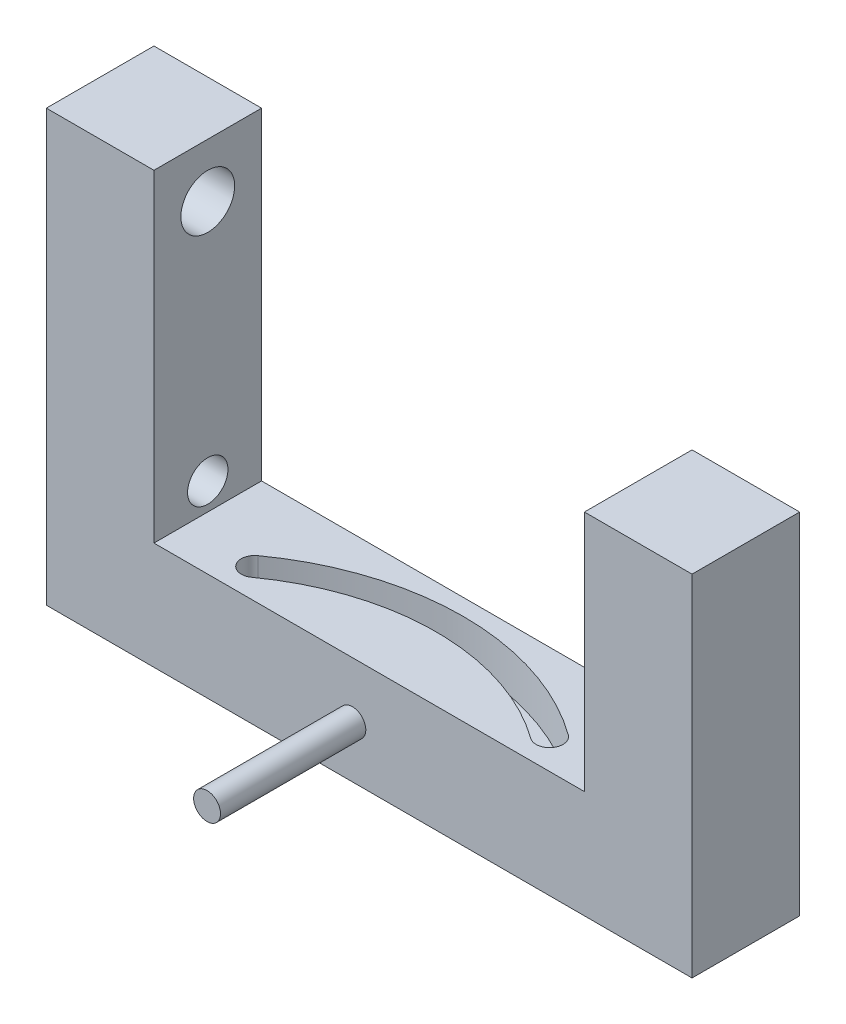
ISO-10303-21;
HEADER;
FILE_DESCRIPTION(('STEP AP214'),'2;1');
FILE_NAME('part.step','',(''),(''),'','','');
FILE_SCHEMA(('AUTOMOTIVE_DESIGN { 1 0 10303 214 1 1 1 1 }'));
ENDSEC;
DATA;
#1=APPLICATION_CONTEXT('core data for automotive mechanical design processes');
#2=APPLICATION_PROTOCOL_DEFINITION('international standard','automotive_design',2000,#1);
#3=PRODUCT_CONTEXT('',#1,'mechanical');
#4=PRODUCT('Part','Part','',(#3));
#5=PRODUCT_RELATED_PRODUCT_CATEGORY('part','',(#4));
#6=PRODUCT_DEFINITION_FORMATION('','',#4);
#7=PRODUCT_DEFINITION_CONTEXT('part definition',#1,'design');
#8=PRODUCT_DEFINITION('design','',#6,#7);
#9=PRODUCT_DEFINITION_SHAPE('','',#8);
#10=(LENGTH_UNIT() NAMED_UNIT(*) SI_UNIT(.MILLI.,.METRE.));
#11=(NAMED_UNIT(*) PLANE_ANGLE_UNIT() SI_UNIT($,.RADIAN.));
#12=(NAMED_UNIT(*) SI_UNIT($,.STERADIAN.) SOLID_ANGLE_UNIT());
#13=UNCERTAINTY_MEASURE_WITH_UNIT(LENGTH_MEASURE(1.E-05),#10,'distance_accuracy_value','');
#14=(GEOMETRIC_REPRESENTATION_CONTEXT(3) GLOBAL_UNCERTAINTY_ASSIGNED_CONTEXT((#13)) GLOBAL_UNIT_ASSIGNED_CONTEXT((#10,
#11,#12)) REPRESENTATION_CONTEXT('',''));
#15=CARTESIAN_POINT('',(0.,0.,0.));
#16=DIRECTION('',(0.,0.,1.));
#17=DIRECTION('',(1.,0.,0.));
#18=AXIS2_PLACEMENT_3D('',#15,#16,#17);
#19=CARTESIAN_POINT('',(304.8,0.,25.4));
#20=DIRECTION('',(0.,1.,0.));
#21=DIRECTION('',(0.,0.,1.));
#22=AXIS2_PLACEMENT_3D('',#19,#20,#21);
#23=PLANE('',#22);
#24=DIRECTION('',(1.,0.,0.));
#25=VECTOR('',#24,1.);
#26=CARTESIAN_POINT('',(304.8,0.,-25.4));
#27=LINE('',#26,#25);
#28=CARTESIAN_POINT('',(0.,0.,-25.4));
#29=VERTEX_POINT('',#28);
#30=CARTESIAN_POINT('',(304.8,0.,-25.4));
#31=VERTEX_POINT('',#30);
#32=EDGE_CURVE('E142',#29,#31,#27,.T.);
#33=ORIENTED_EDGE('',*,*,#32,.T.);
#34=DIRECTION('',(0.,0.,-1.));
#35=VECTOR('',#34,1.);
#36=CARTESIAN_POINT('',(304.8,0.,25.4));
#37=LINE('',#36,#35);
#38=CARTESIAN_POINT('',(304.8,0.,25.4));
#39=VERTEX_POINT('',#38);
#40=EDGE_CURVE('E40',#39,#31,#37,.T.);
#41=ORIENTED_EDGE('',*,*,#40,.F.);
#42=DIRECTION('',(1.,0.,0.));
#43=VECTOR('',#42,1.);
#44=CARTESIAN_POINT('',(304.8,0.,25.4));
#45=LINE('',#44,#43);
#46=CARTESIAN_POINT('',(0.,0.,25.4));
#47=VERTEX_POINT('',#46);
#48=EDGE_CURVE('E158',#47,#39,#45,.T.);
#49=ORIENTED_EDGE('',*,*,#48,.F.);
#50=DIRECTION('',(0.,0.,-1.));
#51=VECTOR('',#50,1.);
#52=CARTESIAN_POINT('',(0.,0.,25.4));
#53=LINE('',#52,#51);
#54=EDGE_CURVE('E138',#47,#29,#53,.T.);
#55=ORIENTED_EDGE('',*,*,#54,.T.);
#56=EDGE_LOOP('',(#33,#41,#49,#55));
#57=FACE_BOUND('',#56,.T.);
#58=ADVANCED_FACE('F33',(#57),#23,.F.);
#59=CARTESIAN_POINT('',(304.8,165.1,25.4));
#60=DIRECTION('',(-1.,0.,0.));
#61=DIRECTION('',(0.,-1.,0.));
#62=AXIS2_PLACEMENT_3D('',#59,#60,#61);
#63=PLANE('',#62);
#64=DIRECTION('',(0.,1.,0.));
#65=VECTOR('',#64,1.);
#66=CARTESIAN_POINT('',(304.8,165.1,-25.4));
#67=LINE('',#66,#65);
#68=CARTESIAN_POINT('',(304.8,165.1,-25.4));
#69=VERTEX_POINT('',#68);
#70=EDGE_CURVE('E145',#31,#69,#67,.T.);
#71=ORIENTED_EDGE('',*,*,#70,.T.);
#72=DIRECTION('',(0.,0.,-1.));
#73=VECTOR('',#72,1.);
#74=CARTESIAN_POINT('',(304.8,165.1,25.4));
#75=LINE('',#74,#73);
#76=CARTESIAN_POINT('',(304.8,165.1,25.4));
#77=VERTEX_POINT('',#76);
#78=EDGE_CURVE('E168',#77,#69,#75,.T.);
#79=ORIENTED_EDGE('',*,*,#78,.F.);
#80=DIRECTION('',(0.,1.,0.));
#81=VECTOR('',#80,1.);
#82=CARTESIAN_POINT('',(304.8,165.1,25.4));
#83=LINE('',#82,#81);
#84=EDGE_CURVE('E98',#39,#77,#83,.T.);
#85=ORIENTED_EDGE('',*,*,#84,.F.);
#86=ORIENTED_EDGE('',*,*,#40,.T.);
#87=EDGE_LOOP('',(#71,#79,#85,#86));
#88=FACE_BOUND('',#87,.T.);
#89=ADVANCED_FACE('F171',(#88),#63,.F.);
#90=CARTESIAN_POINT('',(254.,165.1,25.4));
#91=DIRECTION('',(0.,-1.,0.));
#92=DIRECTION('',(0.,0.,-1.));
#93=AXIS2_PLACEMENT_3D('',#90,#91,#92);
#94=PLANE('',#93);
#95=DIRECTION('',(-1.,0.,0.));
#96=VECTOR('',#95,1.);
#97=CARTESIAN_POINT('',(254.,165.1,-25.4));
#98=LINE('',#97,#96);
#99=CARTESIAN_POINT('',(254.,165.1,-25.4));
#100=VERTEX_POINT('',#99);
#101=EDGE_CURVE('E148',#69,#100,#98,.T.);
#102=ORIENTED_EDGE('',*,*,#101,.T.);
#103=DIRECTION('',(0.,0.,-1.));
#104=VECTOR('',#103,1.);
#105=CARTESIAN_POINT('',(254.,165.1,25.4));
#106=LINE('',#105,#104);
#107=CARTESIAN_POINT('',(254.,165.1,25.4));
#108=VERTEX_POINT('',#107);
#109=EDGE_CURVE('E165',#108,#100,#106,.T.);
#110=ORIENTED_EDGE('',*,*,#109,.F.);
#111=DIRECTION('',(-1.,0.,0.));
#112=VECTOR('',#111,1.);
#113=CARTESIAN_POINT('',(254.,165.1,25.4));
#114=LINE('',#113,#112);
#115=EDGE_CURVE('E189',#77,#108,#114,.T.);
#116=ORIENTED_EDGE('',*,*,#115,.F.);
#117=ORIENTED_EDGE('',*,*,#78,.T.);
#118=EDGE_LOOP('',(#102,#110,#116,#117));
#119=FACE_BOUND('',#118,.T.);
#120=ADVANCED_FACE('F182',(#119),#94,.F.);
#121=CARTESIAN_POINT('',(254.,50.8,25.4));
#122=DIRECTION('',(1.,0.,0.));
#123=DIRECTION('',(0.,0.,-1.));
#124=AXIS2_PLACEMENT_3D('',#121,#122,#123);
#125=PLANE('',#124);
#126=DIRECTION('',(0.,-1.,0.));
#127=VECTOR('',#126,1.);
#128=CARTESIAN_POINT('',(254.,50.8,-25.4));
#129=LINE('',#128,#127);
#130=CARTESIAN_POINT('',(254.,50.8,-25.4));
#131=VERTEX_POINT('',#130);
#132=EDGE_CURVE('E150',#100,#131,#129,.T.);
#133=ORIENTED_EDGE('',*,*,#132,.T.);
#134=DIRECTION('',(0.,0.,-1.));
#135=VECTOR('',#134,1.);
#136=CARTESIAN_POINT('',(254.,50.8,25.4));
#137=LINE('',#136,#135);
#138=CARTESIAN_POINT('',(254.,50.8,25.4));
#139=VERTEX_POINT('',#138);
#140=EDGE_CURVE('E162',#139,#131,#137,.T.);
#141=ORIENTED_EDGE('',*,*,#140,.F.);
#142=DIRECTION('',(0.,-1.,0.));
#143=VECTOR('',#142,1.);
#144=CARTESIAN_POINT('',(254.,50.8,25.4));
#145=LINE('',#144,#143);
#146=EDGE_CURVE('E188',#108,#139,#145,.T.);
#147=ORIENTED_EDGE('',*,*,#146,.F.);
#148=ORIENTED_EDGE('',*,*,#109,.T.);
#149=EDGE_LOOP('',(#133,#141,#147,#148));
#150=FACE_BOUND('',#149,.T.);
#151=ADVANCED_FACE('F186',(#150),#125,.F.);
#152=CARTESIAN_POINT('',(50.8,50.8,25.4));
#153=DIRECTION('',(0.,-1.,0.));
#154=DIRECTION('',(0.,0.,-1.));
#155=AXIS2_PLACEMENT_3D('',#152,#153,#154);
#156=PLANE('',#155);
#157=CARTESIAN_POINT('',(153.726793570624,50.8,107.696834583664));
#158=DIRECTION('',(0.,1.,0.));
#159=DIRECTION('',(0.,0.,1.));
#160=AXIS2_PLACEMENT_3D('',#157,#158,#159);
#161=CIRCLE('',#160,125.335414381413);
#162=CARTESIAN_POINT('',(227.020550619977,50.8,6.02583933058934));
#163=VERTEX_POINT('',#162);
#164=CARTESIAN_POINT('',(80.43303652127,50.8,6.0258393305893));
#165=VERTEX_POINT('',#164);
#166=EDGE_CURVE('E227',#163,#165,#161,.T.);
#167=ORIENTED_EDGE('',*,*,#166,.F.);
#168=CARTESIAN_POINT('',(223.307191873286,50.8,11.1769039601947));
#169=DIRECTION('',(0.,1.,0.));
#170=DIRECTION('',(0.,0.,1.));
#171=AXIS2_PLACEMENT_3D('',#168,#169,#170);
#172=CIRCLE('',#171,6.35000000000001);
#173=CARTESIAN_POINT('',(219.593833126595,50.8,16.3279685898));
#174=VERTEX_POINT('',#173);
#175=EDGE_CURVE('E47',#174,#163,#172,.T.);
#176=ORIENTED_EDGE('',*,*,#175,.F.);
#177=CARTESIAN_POINT('',(153.726793570624,50.8,107.696834583664));
#178=DIRECTION('',(0.,-1.,0.));
#179=DIRECTION('',(0.,0.,1.));
#180=AXIS2_PLACEMENT_3D('',#177,#178,#179);
#181=CIRCLE('',#180,112.635414381413);
#182=CARTESIAN_POINT('',(87.8597540146525,50.8,16.3279685898));
#183=VERTEX_POINT('',#182);
#184=EDGE_CURVE('E220',#183,#174,#181,.T.);
#185=ORIENTED_EDGE('',*,*,#184,.F.);
#186=CARTESIAN_POINT('',(84.1463952679613,50.8,11.1769039601947));
#187=DIRECTION('',(0.,1.,0.));
#188=DIRECTION('',(0.,0.,1.));
#189=AXIS2_PLACEMENT_3D('',#186,#187,#188);
#190=CIRCLE('',#189,6.35000000000001);
#191=EDGE_CURVE('E224',#165,#183,#190,.T.);
#192=ORIENTED_EDGE('',*,*,#191,.F.);
#193=EDGE_LOOP('',(#167,#176,#185,#192));
#194=FACE_BOUND('',#193,.T.);
#195=DIRECTION('',(-1.,0.,0.));
#196=VECTOR('',#195,1.);
#197=CARTESIAN_POINT('',(50.8,50.8,-25.4));
#198=LINE('',#197,#196);
#199=CARTESIAN_POINT('',(50.8,50.8,-25.4));
#200=VERTEX_POINT('',#199);
#201=EDGE_CURVE('E152',#131,#200,#198,.T.);
#202=ORIENTED_EDGE('',*,*,#201,.T.);
#203=DIRECTION('',(0.,0.,-1.));
#204=VECTOR('',#203,1.);
#205=CARTESIAN_POINT('',(50.8,50.8,25.4));
#206=LINE('',#205,#204);
#207=CARTESIAN_POINT('',(50.8,50.8,25.4));
#208=VERTEX_POINT('',#207);
#209=EDGE_CURVE('E133',#208,#200,#206,.T.);
#210=ORIENTED_EDGE('',*,*,#209,.F.);
#211=DIRECTION('',(-1.,0.,0.));
#212=VECTOR('',#211,1.);
#213=CARTESIAN_POINT('',(50.8,50.8,25.4));
#214=LINE('',#213,#212);
#215=EDGE_CURVE('E121',#139,#208,#214,.T.);
#216=ORIENTED_EDGE('',*,*,#215,.F.);
#217=ORIENTED_EDGE('',*,*,#140,.T.);
#218=EDGE_LOOP('',(#202,#210,#216,#217));
#219=FACE_BOUND('',#218,.T.);
#220=ADVANCED_FACE('F268',(#194,#219),#156,.F.);
#221=CARTESIAN_POINT('',(50.8,203.2,25.4));
#222=DIRECTION('',(-1.,0.,0.));
#223=DIRECTION('',(0.,-1.,0.));
#224=AXIS2_PLACEMENT_3D('',#221,#222,#223);
#225=PLANE('',#224);
#226=CARTESIAN_POINT('',(50.8,63.5,0.));
#227=DIRECTION('',(-1.,0.,0.));
#228=DIRECTION('',(0.,0.,1.));
#229=AXIS2_PLACEMENT_3D('',#226,#227,#228);
#230=CIRCLE('',#229,9.525);
#231=CARTESIAN_POINT('',(50.8,63.5,9.525));
#232=VERTEX_POINT('',#231);
#233=EDGE_CURVE('E200',#232,#232,#230,.T.);
#234=ORIENTED_EDGE('',*,*,#233,.T.);
#235=EDGE_LOOP('',(#234));
#236=FACE_BOUND('',#235,.T.);
#237=CARTESIAN_POINT('',(50.8,177.8,0.));
#238=DIRECTION('',(-1.,0.,0.));
#239=DIRECTION('',(0.,-1.,0.));
#240=AXIS2_PLACEMENT_3D('',#237,#238,#239);
#241=CIRCLE('',#240,12.7);
#242=CARTESIAN_POINT('',(50.8,165.1,0.));
#243=VERTEX_POINT('',#242);
#244=EDGE_CURVE('E146',#243,#243,#241,.F.);
#245=ORIENTED_EDGE('',*,*,#244,.F.);
#246=EDGE_LOOP('',(#245));
#247=FACE_BOUND('',#246,.T.);
#248=DIRECTION('',(0.,1.,0.));
#249=VECTOR('',#248,1.);
#250=CARTESIAN_POINT('',(50.8,203.2,-25.4));
#251=LINE('',#250,#249);
#252=CARTESIAN_POINT('',(50.8,203.2,-25.4));
#253=VERTEX_POINT('',#252);
#254=EDGE_CURVE('E130',#200,#253,#251,.T.);
#255=ORIENTED_EDGE('',*,*,#254,.T.);
#256=DIRECTION('',(0.,0.,-1.));
#257=VECTOR('',#256,1.);
#258=CARTESIAN_POINT('',(50.8,203.2,25.4));
#259=LINE('',#258,#257);
#260=CARTESIAN_POINT('',(50.8,203.2,25.4));
#261=VERTEX_POINT('',#260);
#262=EDGE_CURVE('E127',#261,#253,#259,.T.);
#263=ORIENTED_EDGE('',*,*,#262,.F.);
#264=DIRECTION('',(0.,1.,0.));
#265=VECTOR('',#264,1.);
#266=CARTESIAN_POINT('',(50.8,203.2,25.4));
#267=LINE('',#266,#265);
#268=EDGE_CURVE('E114',#208,#261,#267,.T.);
#269=ORIENTED_EDGE('',*,*,#268,.F.);
#270=ORIENTED_EDGE('',*,*,#209,.T.);
#271=EDGE_LOOP('',(#255,#263,#269,#270));
#272=FACE_BOUND('',#271,.T.);
#273=ADVANCED_FACE('F128',(#236,#247,#272),#225,.F.);
#274=CARTESIAN_POINT('',(0.,203.2,25.4));
#275=DIRECTION('',(0.,-1.,0.));
#276=DIRECTION('',(0.,0.,-1.));
#277=AXIS2_PLACEMENT_3D('',#274,#275,#276);
#278=PLANE('',#277);
#279=DIRECTION('',(-1.,0.,0.));
#280=VECTOR('',#279,1.);
#281=CARTESIAN_POINT('',(0.,203.2,-25.4));
#282=LINE('',#281,#280);
#283=CARTESIAN_POINT('',(0.,203.2,-25.4));
#284=VERTEX_POINT('',#283);
#285=EDGE_CURVE('E155',#253,#284,#282,.T.);
#286=ORIENTED_EDGE('',*,*,#285,.T.);
#287=DIRECTION('',(0.,0.,-1.));
#288=VECTOR('',#287,1.);
#289=CARTESIAN_POINT('',(0.,203.2,25.4));
#290=LINE('',#289,#288);
#291=CARTESIAN_POINT('',(0.,203.2,25.4));
#292=VERTEX_POINT('',#291);
#293=EDGE_CURVE('E134',#292,#284,#290,.T.);
#294=ORIENTED_EDGE('',*,*,#293,.F.);
#295=DIRECTION('',(-1.,0.,0.));
#296=VECTOR('',#295,1.);
#297=CARTESIAN_POINT('',(0.,203.2,25.4));
#298=LINE('',#297,#296);
#299=EDGE_CURVE('E118',#261,#292,#298,.T.);
#300=ORIENTED_EDGE('',*,*,#299,.F.);
#301=ORIENTED_EDGE('',*,*,#262,.T.);
#302=EDGE_LOOP('',(#286,#294,#300,#301));
#303=FACE_BOUND('',#302,.T.);
#304=ADVANCED_FACE('F136',(#303),#278,.F.);
#305=CARTESIAN_POINT('',(0.,0.,25.4));
#306=DIRECTION('',(1.,0.,0.));
#307=DIRECTION('',(0.,0.,-1.));
#308=AXIS2_PLACEMENT_3D('',#305,#306,#307);
#309=PLANE('',#308);
#310=CARTESIAN_POINT('',(0.,63.5,0.));
#311=DIRECTION('',(-1.,0.,0.));
#312=DIRECTION('',(0.,0.,1.));
#313=AXIS2_PLACEMENT_3D('',#310,#311,#312);
#314=CIRCLE('',#313,9.525);
#315=CARTESIAN_POINT('',(0.,63.5,9.525));
#316=VERTEX_POINT('',#315);
#317=EDGE_CURVE('E201',#316,#316,#314,.T.);
#318=ORIENTED_EDGE('',*,*,#317,.F.);
#319=EDGE_LOOP('',(#318));
#320=FACE_BOUND('',#319,.T.);
#321=CARTESIAN_POINT('',(0.,177.8,0.));
#322=DIRECTION('',(-1.,0.,0.));
#323=DIRECTION('',(0.,0.,1.));
#324=AXIS2_PLACEMENT_3D('',#321,#322,#323);
#325=CIRCLE('',#324,12.7);
#326=CARTESIAN_POINT('',(0.,177.8,12.7));
#327=VERTEX_POINT('',#326);
#328=EDGE_CURVE('E197',#327,#327,#325,.T.);
#329=ORIENTED_EDGE('',*,*,#328,.F.);
#330=EDGE_LOOP('',(#329));
#331=FACE_BOUND('',#330,.T.);
#332=DIRECTION('',(0.,-1.,0.));
#333=VECTOR('',#332,1.);
#334=CARTESIAN_POINT('',(0.,0.,-25.4));
#335=LINE('',#334,#333);
#336=EDGE_CURVE('E89',#284,#29,#335,.T.);
#337=ORIENTED_EDGE('',*,*,#336,.T.);
#338=ORIENTED_EDGE('',*,*,#54,.F.);
#339=DIRECTION('',(0.,-1.,0.));
#340=VECTOR('',#339,1.);
#341=CARTESIAN_POINT('',(0.,0.,25.4));
#342=LINE('',#341,#340);
#343=EDGE_CURVE('E56',#292,#47,#342,.T.);
#344=ORIENTED_EDGE('',*,*,#343,.F.);
#345=ORIENTED_EDGE('',*,*,#293,.T.);
#346=EDGE_LOOP('',(#337,#338,#344,#345));
#347=FACE_BOUND('',#346,.T.);
#348=ADVANCED_FACE('F299',(#320,#331,#347),#309,.F.);
#349=CARTESIAN_POINT('',(0.,0.,25.4));
#350=DIRECTION('',(0.,0.,-1.));
#351=DIRECTION('',(-1.,0.,0.));
#352=AXIS2_PLACEMENT_3D('',#349,#350,#351);
#353=PLANE('',#352);
#354=CARTESIAN_POINT('',(144.449989541016,24.4041060454379,25.4));
#355=DIRECTION('',(0.,0.,-1.));
#356=DIRECTION('',(-1.,0.,0.));
#357=AXIS2_PLACEMENT_3D('',#354,#355,#356);
#358=CIRCLE('',#357,6.35);
#359=CARTESIAN_POINT('',(138.099989541016,24.4041060454379,25.4));
#360=VERTEX_POINT('',#359);
#361=EDGE_CURVE('E11',#360,#360,#358,.F.);
#362=ORIENTED_EDGE('',*,*,#361,.F.);
#363=EDGE_LOOP('',(#362));
#364=FACE_BOUND('',#363,.T.);
#365=ORIENTED_EDGE('',*,*,#48,.T.);
#366=ORIENTED_EDGE('',*,*,#84,.T.);
#367=ORIENTED_EDGE('',*,*,#115,.T.);
#368=ORIENTED_EDGE('',*,*,#146,.T.);
#369=ORIENTED_EDGE('',*,*,#215,.T.);
#370=ORIENTED_EDGE('',*,*,#268,.T.);
#371=ORIENTED_EDGE('',*,*,#299,.T.);
#372=ORIENTED_EDGE('',*,*,#343,.T.);
#373=EDGE_LOOP('',(#365,#366,#367,#368,#369,#370,#371,#372));
#374=FACE_BOUND('',#373,.T.);
#375=ADVANCED_FACE('F116',(#364,#374),#353,.F.);
#376=CARTESIAN_POINT('',(0.,0.,-25.4));
#377=DIRECTION('',(0.,0.,-1.));
#378=DIRECTION('',(-1.,0.,0.));
#379=AXIS2_PLACEMENT_3D('',#376,#377,#378);
#380=PLANE('',#379);
#381=ORIENTED_EDGE('',*,*,#32,.F.);
#382=ORIENTED_EDGE('',*,*,#336,.F.);
#383=ORIENTED_EDGE('',*,*,#285,.F.);
#384=ORIENTED_EDGE('',*,*,#254,.F.);
#385=ORIENTED_EDGE('',*,*,#201,.F.);
#386=ORIENTED_EDGE('',*,*,#132,.F.);
#387=ORIENTED_EDGE('',*,*,#101,.F.);
#388=ORIENTED_EDGE('',*,*,#70,.F.);
#389=EDGE_LOOP('',(#381,#382,#383,#384,#385,#386,#387,#388));
#390=FACE_BOUND('',#389,.T.);
#391=ADVANCED_FACE('F176',(#390),#380,.T.);
#392=CARTESIAN_POINT('',(304.801,177.8,0.));
#393=DIRECTION('',(-1.,0.,0.));
#394=DIRECTION('',(0.,0.,1.));
#395=AXIS2_PLACEMENT_3D('',#392,#393,#394);
#396=CYLINDRICAL_SURFACE('',#395,12.7);
#397=ORIENTED_EDGE('',*,*,#328,.T.);
#398=EDGE_LOOP('',(#397));
#399=FACE_BOUND('',#398,.T.);
#400=ORIENTED_EDGE('',*,*,#244,.T.);
#401=EDGE_LOOP('',(#400));
#402=FACE_BOUND('',#401,.T.);
#403=ADVANCED_FACE('F305',(#399,#402),#396,.F.);
#404=CARTESIAN_POINT('',(50.8,63.5,0.));
#405=DIRECTION('',(-1.,0.,0.));
#406=DIRECTION('',(0.,0.,1.));
#407=AXIS2_PLACEMENT_3D('',#404,#405,#406);
#408=CYLINDRICAL_SURFACE('',#407,9.525);
#409=ORIENTED_EDGE('',*,*,#233,.F.);
#410=EDGE_LOOP('',(#409));
#411=FACE_BOUND('',#410,.T.);
#412=ORIENTED_EDGE('',*,*,#317,.T.);
#413=EDGE_LOOP('',(#412));
#414=FACE_BOUND('',#413,.T.);
#415=ADVANCED_FACE('F311',(#411,#414),#408,.F.);
#416=CARTESIAN_POINT('',(144.449989541016,24.4041060454379,93.98));
#417=DIRECTION('',(0.,0.,-1.));
#418=DIRECTION('',(-1.,0.,0.));
#419=AXIS2_PLACEMENT_3D('',#416,#417,#418);
#420=CYLINDRICAL_SURFACE('',#419,6.35);
#421=CARTESIAN_POINT('',(144.449989541016,24.4041060454379,93.98));
#422=DIRECTION('',(0.,0.,1.));
#423=DIRECTION('',(1.,0.,0.));
#424=AXIS2_PLACEMENT_3D('',#421,#422,#423);
#425=CIRCLE('',#424,6.35);
#426=CARTESIAN_POINT('',(150.799989541016,24.4041060454379,93.98));
#427=VERTEX_POINT('',#426);
#428=EDGE_CURVE('E204',#427,#427,#425,.T.);
#429=ORIENTED_EDGE('',*,*,#428,.F.);
#430=EDGE_LOOP('',(#429));
#431=FACE_BOUND('',#430,.T.);
#432=ORIENTED_EDGE('',*,*,#361,.T.);
#433=EDGE_LOOP('',(#432));
#434=FACE_BOUND('',#433,.T.);
#435=ADVANCED_FACE('F315',(#431,#434),#420,.T.);
#436=CARTESIAN_POINT('',(144.449989541016,24.4041060454379,93.98));
#437=DIRECTION('',(0.,0.,1.));
#438=DIRECTION('',(1.,0.,0.));
#439=AXIS2_PLACEMENT_3D('',#436,#437,#438);
#440=PLANE('',#439);
#441=ORIENTED_EDGE('',*,*,#428,.T.);
#442=EDGE_LOOP('',(#441));
#443=FACE_BOUND('',#442,.T.);
#444=ADVANCED_FACE('F319',(#443),#440,.T.);
#445=CARTESIAN_POINT('',(223.307191873286,31.75,11.1769039601947));
#446=DIRECTION('',(0.,1.,0.));
#447=DIRECTION('',(0.,0.,1.));
#448=AXIS2_PLACEMENT_3D('',#445,#446,#447);
#449=CYLINDRICAL_SURFACE('',#448,6.35000000000001);
#450=ORIENTED_EDGE('',*,*,#175,.T.);
#451=DIRECTION('',(0.,1.,0.));
#452=VECTOR('',#451,1.);
#453=CARTESIAN_POINT('',(227.020550619977,31.75,6.02583933058934));
#454=LINE('',#453,#452);
#455=CARTESIAN_POINT('',(227.020550619977,31.75,6.02583933058934));
#456=VERTEX_POINT('',#455);
#457=EDGE_CURVE('E210',#456,#163,#454,.T.);
#458=ORIENTED_EDGE('',*,*,#457,.F.);
#459=CARTESIAN_POINT('',(223.307191873286,31.75,11.1769039601947));
#460=DIRECTION('',(0.,1.,0.));
#461=DIRECTION('',(0.,0.,1.));
#462=AXIS2_PLACEMENT_3D('',#459,#460,#461);
#463=CIRCLE('',#462,6.35000000000001);
#464=CARTESIAN_POINT('',(219.593833126595,31.75,16.3279685898));
#465=VERTEX_POINT('',#464);
#466=EDGE_CURVE('E223',#465,#456,#463,.T.);
#467=ORIENTED_EDGE('',*,*,#466,.F.);
#468=DIRECTION('',(0.,1.,0.));
#469=VECTOR('',#468,1.);
#470=CARTESIAN_POINT('',(219.593833126595,31.75,16.3279685898));
#471=LINE('',#470,#469);
#472=EDGE_CURVE('E209',#465,#174,#471,.T.);
#473=ORIENTED_EDGE('',*,*,#472,.T.);
#474=EDGE_LOOP('',(#450,#458,#467,#473));
#475=FACE_BOUND('',#474,.T.);
#476=ADVANCED_FACE('F248',(#475),#449,.F.);
#477=CARTESIAN_POINT('',(153.726793570624,31.75,107.696834583664));
#478=DIRECTION('',(0.,1.,0.));
#479=DIRECTION('',(0.,0.,1.));
#480=AXIS2_PLACEMENT_3D('',#477,#478,#479);
#481=CYLINDRICAL_SURFACE('',#480,112.635414381413);
#482=ORIENTED_EDGE('',*,*,#184,.T.);
#483=ORIENTED_EDGE('',*,*,#472,.F.);
#484=CARTESIAN_POINT('',(153.726793570624,31.75,107.696834583664));
#485=DIRECTION('',(0.,-1.,0.));
#486=DIRECTION('',(0.,0.,1.));
#487=AXIS2_PLACEMENT_3D('',#484,#485,#486);
#488=CIRCLE('',#487,112.635414381413);
#489=CARTESIAN_POINT('',(87.8597540146525,31.75,16.3279685898));
#490=VERTEX_POINT('',#489);
#491=EDGE_CURVE('E213',#490,#465,#488,.T.);
#492=ORIENTED_EDGE('',*,*,#491,.F.);
#493=DIRECTION('',(0.,1.,0.));
#494=VECTOR('',#493,1.);
#495=CARTESIAN_POINT('',(87.8597540146525,31.75,16.3279685898));
#496=LINE('',#495,#494);
#497=EDGE_CURVE('E216',#490,#183,#496,.T.);
#498=ORIENTED_EDGE('',*,*,#497,.T.);
#499=EDGE_LOOP('',(#482,#483,#492,#498));
#500=FACE_BOUND('',#499,.T.);
#501=ADVANCED_FACE('F259',(#500),#481,.T.);
#502=CARTESIAN_POINT('',(84.1463952679613,31.75,11.1769039601947));
#503=DIRECTION('',(0.,1.,0.));
#504=DIRECTION('',(0.,0.,1.));
#505=AXIS2_PLACEMENT_3D('',#502,#503,#504);
#506=CYLINDRICAL_SURFACE('',#505,6.35000000000001);
#507=ORIENTED_EDGE('',*,*,#191,.T.);
#508=ORIENTED_EDGE('',*,*,#497,.F.);
#509=CARTESIAN_POINT('',(84.1463952679613,31.75,11.1769039601947));
#510=DIRECTION('',(0.,1.,0.));
#511=DIRECTION('',(0.,0.,1.));
#512=AXIS2_PLACEMENT_3D('',#509,#510,#511);
#513=CIRCLE('',#512,6.35000000000001);
#514=CARTESIAN_POINT('',(80.43303652127,31.75,6.0258393305893));
#515=VERTEX_POINT('',#514);
#516=EDGE_CURVE('E233',#515,#490,#513,.T.);
#517=ORIENTED_EDGE('',*,*,#516,.F.);
#518=DIRECTION('',(0.,1.,0.));
#519=VECTOR('',#518,1.);
#520=CARTESIAN_POINT('',(80.43303652127,31.75,6.0258393305893));
#521=LINE('',#520,#519);
#522=EDGE_CURVE('E212',#515,#165,#521,.T.);
#523=ORIENTED_EDGE('',*,*,#522,.T.);
#524=EDGE_LOOP('',(#507,#508,#517,#523));
#525=FACE_BOUND('',#524,.T.);
#526=ADVANCED_FACE('F264',(#525),#506,.F.);
#527=CARTESIAN_POINT('',(153.726793570624,31.75,107.696834583664));
#528=DIRECTION('',(0.,1.,0.));
#529=DIRECTION('',(0.,0.,1.));
#530=AXIS2_PLACEMENT_3D('',#527,#528,#529);
#531=CYLINDRICAL_SURFACE('',#530,125.335414381413);
#532=ORIENTED_EDGE('',*,*,#166,.T.);
#533=ORIENTED_EDGE('',*,*,#522,.F.);
#534=CARTESIAN_POINT('',(153.726793570624,31.75,107.696834583664));
#535=DIRECTION('',(0.,1.,0.));
#536=DIRECTION('',(0.,0.,1.));
#537=AXIS2_PLACEMENT_3D('',#534,#535,#536);
#538=CIRCLE('',#537,125.335414381413);
#539=EDGE_CURVE('E236',#456,#515,#538,.T.);
#540=ORIENTED_EDGE('',*,*,#539,.F.);
#541=ORIENTED_EDGE('',*,*,#457,.T.);
#542=EDGE_LOOP('',(#532,#533,#540,#541));
#543=FACE_BOUND('',#542,.T.);
#544=ADVANCED_FACE('F271',(#543),#531,.F.);
#545=CARTESIAN_POINT('',(188.516992721955,31.75,59.4368692719294));
#546=DIRECTION('',(0.,1.,0.));
#547=DIRECTION('',(0.,0.,1.));
#548=AXIS2_PLACEMENT_3D('',#545,#546,#547);
#549=PLANE('',#548);
#550=ORIENTED_EDGE('',*,*,#466,.T.);
#551=ORIENTED_EDGE('',*,*,#539,.T.);
#552=ORIENTED_EDGE('',*,*,#516,.T.);
#553=ORIENTED_EDGE('',*,*,#491,.T.);
#554=EDGE_LOOP('',(#550,#551,#552,#553));
#555=FACE_BOUND('',#554,.T.);
#556=ADVANCED_FACE('F243',(#555),#549,.T.);
#557=CLOSED_SHELL('',(#58,#89,#120,#151,#220,#273,#304,#348,#375,#391,#403,#415,#435,#444,#476,
#501,#526,#544,#556));
#558=MANIFOLD_SOLID_BREP('B2',#557);
#559=ADVANCED_BREP_SHAPE_REPRESENTATION('',(#18,#558),#14);
#560=SHAPE_DEFINITION_REPRESENTATION(#9,#559);
ENDSEC;
END-ISO-10303-21;
